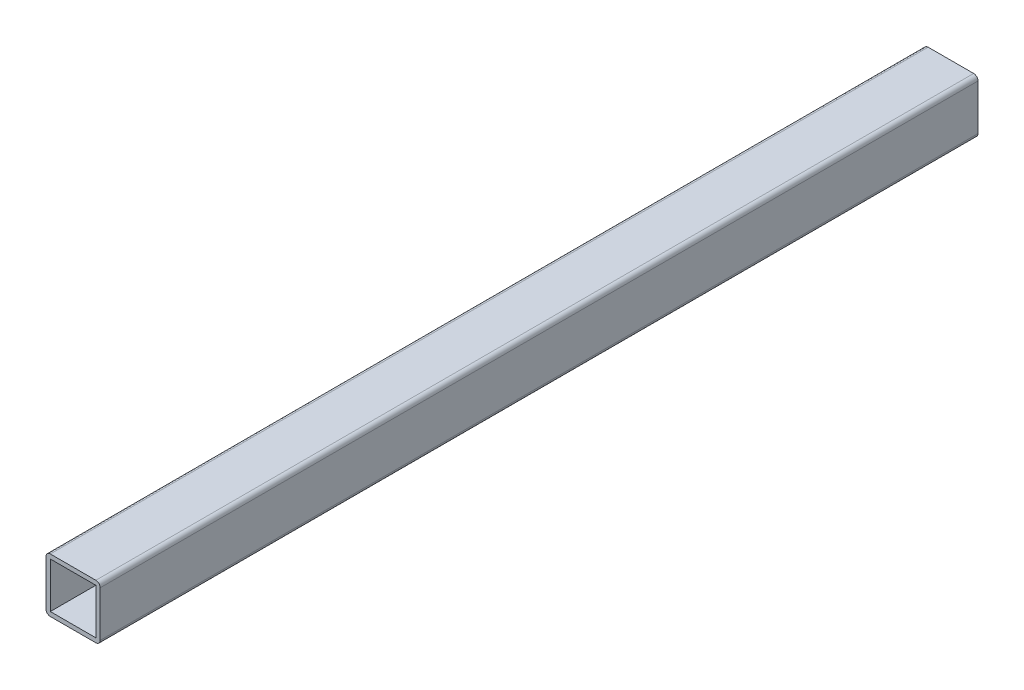
ISO-10303-21;
HEADER;
FILE_DESCRIPTION(('STEP AP214'),'2;1');
FILE_NAME('part.step','',(''),(''),'','','');
FILE_SCHEMA(('AUTOMOTIVE_DESIGN { 1 0 10303 214 1 1 1 1 }'));
ENDSEC;
DATA;
#1=APPLICATION_CONTEXT('core data for automotive mechanical design processes');
#2=APPLICATION_PROTOCOL_DEFINITION('international standard','automotive_design',2000,#1);
#3=PRODUCT_CONTEXT('',#1,'mechanical');
#4=PRODUCT('Part','Part','',(#3));
#5=PRODUCT_RELATED_PRODUCT_CATEGORY('part','',(#4));
#6=PRODUCT_DEFINITION_FORMATION('','',#4);
#7=PRODUCT_DEFINITION_CONTEXT('part definition',#1,'design');
#8=PRODUCT_DEFINITION('design','',#6,#7);
#9=PRODUCT_DEFINITION_SHAPE('','',#8);
#10=(LENGTH_UNIT() NAMED_UNIT(*) SI_UNIT(.MILLI.,.METRE.));
#11=(NAMED_UNIT(*) PLANE_ANGLE_UNIT() SI_UNIT($,.RADIAN.));
#12=(NAMED_UNIT(*) SI_UNIT($,.STERADIAN.) SOLID_ANGLE_UNIT());
#13=UNCERTAINTY_MEASURE_WITH_UNIT(LENGTH_MEASURE(1.E-05),#10,'distance_accuracy_value','');
#14=(GEOMETRIC_REPRESENTATION_CONTEXT(3) GLOBAL_UNCERTAINTY_ASSIGNED_CONTEXT((#13)) GLOBAL_UNIT_ASSIGNED_CONTEXT((#10,
#11,#12)) REPRESENTATION_CONTEXT('',''));
#15=CARTESIAN_POINT('',(0.,0.,0.));
#16=DIRECTION('',(0.,0.,1.));
#17=DIRECTION('',(1.,0.,0.));
#18=AXIS2_PLACEMENT_3D('',#15,#16,#17);
#19=CARTESIAN_POINT('',(4.,46.,810.));
#20=DIRECTION('',(0.,0.,-1.));
#21=DIRECTION('',(-1.,0.,0.));
#22=AXIS2_PLACEMENT_3D('',#19,#20,#21);
#23=PLANE('',#22);
#24=CARTESIAN_POINT('',(4.,46.,810.));
#25=DIRECTION('',(0.,0.,1.));
#26=DIRECTION('',(-1.,0.,0.));
#27=AXIS2_PLACEMENT_3D('',#24,#25,#26);
#28=CIRCLE('',#27,4.);
#29=CARTESIAN_POINT('',(4.,50.,810.));
#30=VERTEX_POINT('',#29);
#31=CARTESIAN_POINT('',(0.,46.,810.));
#32=VERTEX_POINT('',#31);
#33=EDGE_CURVE('E159',#30,#32,#28,.T.);
#34=ORIENTED_EDGE('',*,*,#33,.T.);
#35=DIRECTION('',(0.,-1.,0.));
#36=VECTOR('',#35,1.);
#37=CARTESIAN_POINT('',(0.,4.00000000000003,810.));
#38=LINE('',#37,#36);
#39=CARTESIAN_POINT('',(0.,4.00000000000003,810.));
#40=VERTEX_POINT('',#39);
#41=EDGE_CURVE('E162',#32,#40,#38,.T.);
#42=ORIENTED_EDGE('',*,*,#41,.T.);
#43=CARTESIAN_POINT('',(4.,4.,810.));
#44=DIRECTION('',(0.,0.,1.));
#45=DIRECTION('',(-1.,0.,0.));
#46=AXIS2_PLACEMENT_3D('',#43,#44,#45);
#47=CIRCLE('',#46,4.);
#48=CARTESIAN_POINT('',(4.00000000000003,0.,810.));
#49=VERTEX_POINT('',#48);
#50=EDGE_CURVE('E165',#40,#49,#47,.T.);
#51=ORIENTED_EDGE('',*,*,#50,.T.);
#52=DIRECTION('',(1.,0.,0.));
#53=VECTOR('',#52,1.);
#54=CARTESIAN_POINT('',(4.00000000000003,0.,810.));
#55=LINE('',#54,#53);
#56=CARTESIAN_POINT('',(46.,0.,810.));
#57=VERTEX_POINT('',#56);
#58=EDGE_CURVE('E167',#49,#57,#55,.T.);
#59=ORIENTED_EDGE('',*,*,#58,.T.);
#60=CARTESIAN_POINT('',(46.,4.,810.));
#61=DIRECTION('',(0.,0.,1.));
#62=DIRECTION('',(1.,0.,0.));
#63=AXIS2_PLACEMENT_3D('',#60,#61,#62);
#64=CIRCLE('',#63,4.);
#65=CARTESIAN_POINT('',(50.,4.,810.));
#66=VERTEX_POINT('',#65);
#67=EDGE_CURVE('E169',#57,#66,#64,.T.);
#68=ORIENTED_EDGE('',*,*,#67,.T.);
#69=DIRECTION('',(0.,1.,0.));
#70=VECTOR('',#69,1.);
#71=CARTESIAN_POINT('',(50.,4.,810.));
#72=LINE('',#71,#70);
#73=CARTESIAN_POINT('',(50.,46.,810.));
#74=VERTEX_POINT('',#73);
#75=EDGE_CURVE('E171',#66,#74,#72,.T.);
#76=ORIENTED_EDGE('',*,*,#75,.T.);
#77=CARTESIAN_POINT('',(46.,46.,810.));
#78=DIRECTION('',(0.,0.,1.));
#79=DIRECTION('',(1.,0.,0.));
#80=AXIS2_PLACEMENT_3D('',#77,#78,#79);
#81=CIRCLE('',#80,4.);
#82=CARTESIAN_POINT('',(46.,50.,810.));
#83=VERTEX_POINT('',#82);
#84=EDGE_CURVE('E173',#74,#83,#81,.T.);
#85=ORIENTED_EDGE('',*,*,#84,.T.);
#86=DIRECTION('',(-1.,0.,0.));
#87=VECTOR('',#86,1.);
#88=CARTESIAN_POINT('',(4.,50.,810.));
#89=LINE('',#88,#87);
#90=EDGE_CURVE('E175',#83,#30,#89,.T.);
#91=ORIENTED_EDGE('',*,*,#90,.T.);
#92=EDGE_LOOP('',(#34,#42,#51,#59,#68,#76,#85,#91));
#93=FACE_BOUND('',#92,.T.);
#94=DIRECTION('',(0.,-1.,0.));
#95=VECTOR('',#94,1.);
#96=CARTESIAN_POINT('',(4.,46.,810.));
#97=LINE('',#96,#95);
#98=CARTESIAN_POINT('',(4.,46.,810.));
#99=VERTEX_POINT('',#98);
#100=CARTESIAN_POINT('',(4.00000000000001,4.,810.));
#101=VERTEX_POINT('',#100);
#102=EDGE_CURVE('E123',#99,#101,#97,.T.);
#103=ORIENTED_EDGE('',*,*,#102,.F.);
#104=DIRECTION('',(-1.,0.,0.));
#105=VECTOR('',#104,1.);
#106=CARTESIAN_POINT('',(4.,46.,810.));
#107=LINE('',#106,#105);
#108=CARTESIAN_POINT('',(46.,46.,810.));
#109=VERTEX_POINT('',#108);
#110=EDGE_CURVE('E145',#109,#99,#107,.T.);
#111=ORIENTED_EDGE('',*,*,#110,.F.);
#112=DIRECTION('',(0.,1.,0.));
#113=VECTOR('',#112,1.);
#114=CARTESIAN_POINT('',(46.,46.,810.));
#115=LINE('',#114,#113);
#116=CARTESIAN_POINT('',(46.,4.,810.));
#117=VERTEX_POINT('',#116);
#118=EDGE_CURVE('E143',#117,#109,#115,.T.);
#119=ORIENTED_EDGE('',*,*,#118,.F.);
#120=DIRECTION('',(1.,0.,0.));
#121=VECTOR('',#120,1.);
#122=CARTESIAN_POINT('',(4.00000000000001,4.,810.));
#123=LINE('',#122,#121);
#124=EDGE_CURVE('E131',#101,#117,#123,.T.);
#125=ORIENTED_EDGE('',*,*,#124,.F.);
#126=EDGE_LOOP('',(#103,#111,#119,#125));
#127=FACE_BOUND('',#126,.T.);
#128=ADVANCED_FACE('F34',(#93,#127),#23,.F.);
#129=CARTESIAN_POINT('',(4.,46.,0.));
#130=DIRECTION('',(0.,0.,-1.));
#131=DIRECTION('',(-1.,0.,0.));
#132=AXIS2_PLACEMENT_3D('',#129,#130,#131);
#133=PLANE('',#132);
#134=CARTESIAN_POINT('',(4.,46.,0.));
#135=DIRECTION('',(0.,0.,1.));
#136=DIRECTION('',(-1.,0.,0.));
#137=AXIS2_PLACEMENT_3D('',#134,#135,#136);
#138=CIRCLE('',#137,4.);
#139=CARTESIAN_POINT('',(4.,50.,0.));
#140=VERTEX_POINT('',#139);
#141=CARTESIAN_POINT('',(0.,46.,0.));
#142=VERTEX_POINT('',#141);
#143=EDGE_CURVE('E139',#140,#142,#138,.T.);
#144=ORIENTED_EDGE('',*,*,#143,.F.);
#145=DIRECTION('',(-1.,0.,0.));
#146=VECTOR('',#145,1.);
#147=CARTESIAN_POINT('',(4.,50.,0.));
#148=LINE('',#147,#146);
#149=CARTESIAN_POINT('',(46.,50.,0.));
#150=VERTEX_POINT('',#149);
#151=EDGE_CURVE('E163',#150,#140,#148,.T.);
#152=ORIENTED_EDGE('',*,*,#151,.F.);
#153=CARTESIAN_POINT('',(46.,46.,0.));
#154=DIRECTION('',(0.,0.,1.));
#155=DIRECTION('',(1.,0.,0.));
#156=AXIS2_PLACEMENT_3D('',#153,#154,#155);
#157=CIRCLE('',#156,4.);
#158=CARTESIAN_POINT('',(50.,46.,0.));
#159=VERTEX_POINT('',#158);
#160=EDGE_CURVE('E190',#159,#150,#157,.T.);
#161=ORIENTED_EDGE('',*,*,#160,.F.);
#162=DIRECTION('',(0.,1.,0.));
#163=VECTOR('',#162,1.);
#164=CARTESIAN_POINT('',(50.,4.,0.));
#165=LINE('',#164,#163);
#166=CARTESIAN_POINT('',(50.,4.,0.));
#167=VERTEX_POINT('',#166);
#168=EDGE_CURVE('E188',#167,#159,#165,.T.);
#169=ORIENTED_EDGE('',*,*,#168,.F.);
#170=CARTESIAN_POINT('',(46.,4.,0.));
#171=DIRECTION('',(0.,0.,1.));
#172=DIRECTION('',(1.,0.,0.));
#173=AXIS2_PLACEMENT_3D('',#170,#171,#172);
#174=CIRCLE('',#173,4.);
#175=CARTESIAN_POINT('',(46.,0.,0.));
#176=VERTEX_POINT('',#175);
#177=EDGE_CURVE('E186',#176,#167,#174,.T.);
#178=ORIENTED_EDGE('',*,*,#177,.F.);
#179=DIRECTION('',(1.,0.,0.));
#180=VECTOR('',#179,1.);
#181=CARTESIAN_POINT('',(4.00000000000003,0.,0.));
#182=LINE('',#181,#180);
#183=CARTESIAN_POINT('',(4.00000000000003,0.,0.));
#184=VERTEX_POINT('',#183);
#185=EDGE_CURVE('E184',#184,#176,#182,.T.);
#186=ORIENTED_EDGE('',*,*,#185,.F.);
#187=CARTESIAN_POINT('',(4.,4.,0.));
#188=DIRECTION('',(0.,0.,1.));
#189=DIRECTION('',(-1.,0.,0.));
#190=AXIS2_PLACEMENT_3D('',#187,#188,#189);
#191=CIRCLE('',#190,4.);
#192=CARTESIAN_POINT('',(0.,4.00000000000003,0.));
#193=VERTEX_POINT('',#192);
#194=EDGE_CURVE('E182',#193,#184,#191,.T.);
#195=ORIENTED_EDGE('',*,*,#194,.F.);
#196=DIRECTION('',(0.,-1.,0.));
#197=VECTOR('',#196,1.);
#198=CARTESIAN_POINT('',(0.,4.00000000000003,0.));
#199=LINE('',#198,#197);
#200=EDGE_CURVE('E180',#142,#193,#199,.T.);
#201=ORIENTED_EDGE('',*,*,#200,.F.);
#202=EDGE_LOOP('',(#144,#152,#161,#169,#178,#186,#195,#201));
#203=FACE_BOUND('',#202,.T.);
#204=DIRECTION('',(-1.,0.,0.));
#205=VECTOR('',#204,1.);
#206=CARTESIAN_POINT('',(4.,46.,0.));
#207=LINE('',#206,#205);
#208=CARTESIAN_POINT('',(46.,46.,0.));
#209=VERTEX_POINT('',#208);
#210=CARTESIAN_POINT('',(4.,46.,0.));
#211=VERTEX_POINT('',#210);
#212=EDGE_CURVE('E132',#209,#211,#207,.T.);
#213=ORIENTED_EDGE('',*,*,#212,.T.);
#214=DIRECTION('',(0.,-1.,0.));
#215=VECTOR('',#214,1.);
#216=CARTESIAN_POINT('',(4.,46.,0.));
#217=LINE('',#216,#215);
#218=CARTESIAN_POINT('',(4.00000000000001,4.,0.));
#219=VERTEX_POINT('',#218);
#220=EDGE_CURVE('E57',#211,#219,#217,.T.);
#221=ORIENTED_EDGE('',*,*,#220,.T.);
#222=DIRECTION('',(1.,0.,0.));
#223=VECTOR('',#222,1.);
#224=CARTESIAN_POINT('',(4.00000000000001,4.,0.));
#225=LINE('',#224,#223);
#226=CARTESIAN_POINT('',(46.,4.,0.));
#227=VERTEX_POINT('',#226);
#228=EDGE_CURVE('E138',#219,#227,#225,.T.);
#229=ORIENTED_EDGE('',*,*,#228,.T.);
#230=DIRECTION('',(0.,1.,0.));
#231=VECTOR('',#230,1.);
#232=CARTESIAN_POINT('',(46.,46.,0.));
#233=LINE('',#232,#231);
#234=EDGE_CURVE('E151',#227,#209,#233,.T.);
#235=ORIENTED_EDGE('',*,*,#234,.T.);
#236=EDGE_LOOP('',(#213,#221,#229,#235));
#237=FACE_BOUND('',#236,.T.);
#238=ADVANCED_FACE('F220',(#203,#237),#133,.T.);
#239=CARTESIAN_POINT('',(4.,46.,810.));
#240=DIRECTION('',(0.,0.,-1.));
#241=DIRECTION('',(-1.,0.,0.));
#242=AXIS2_PLACEMENT_3D('',#239,#240,#241);
#243=CYLINDRICAL_SURFACE('',#242,4.);
#244=ORIENTED_EDGE('',*,*,#143,.T.);
#245=DIRECTION('',(0.,0.,-1.));
#246=VECTOR('',#245,1.);
#247=CARTESIAN_POINT('',(0.,46.,810.));
#248=LINE('',#247,#246);
#249=EDGE_CURVE('E11',#32,#142,#248,.T.);
#250=ORIENTED_EDGE('',*,*,#249,.F.);
#251=ORIENTED_EDGE('',*,*,#33,.F.);
#252=DIRECTION('',(0.,0.,-1.));
#253=VECTOR('',#252,1.);
#254=CARTESIAN_POINT('',(4.,50.,810.));
#255=LINE('',#254,#253);
#256=EDGE_CURVE('E177',#30,#140,#255,.T.);
#257=ORIENTED_EDGE('',*,*,#256,.T.);
#258=EDGE_LOOP('',(#244,#250,#251,#257));
#259=FACE_BOUND('',#258,.T.);
#260=ADVANCED_FACE('F36',(#259),#243,.T.);
#261=CARTESIAN_POINT('',(0.,4.00000000000003,810.));
#262=DIRECTION('',(1.,0.,0.));
#263=DIRECTION('',(0.,0.,-1.));
#264=AXIS2_PLACEMENT_3D('',#261,#262,#263);
#265=PLANE('',#264);
#266=ORIENTED_EDGE('',*,*,#200,.T.);
#267=DIRECTION('',(0.,0.,-1.));
#268=VECTOR('',#267,1.);
#269=CARTESIAN_POINT('',(0.,4.00000000000003,810.));
#270=LINE('',#269,#268);
#271=EDGE_CURVE('E42',#40,#193,#270,.T.);
#272=ORIENTED_EDGE('',*,*,#271,.F.);
#273=ORIENTED_EDGE('',*,*,#41,.F.);
#274=ORIENTED_EDGE('',*,*,#249,.T.);
#275=EDGE_LOOP('',(#266,#272,#273,#274));
#276=FACE_BOUND('',#275,.T.);
#277=ADVANCED_FACE('F237',(#276),#265,.F.);
#278=CARTESIAN_POINT('',(4.,4.,810.));
#279=DIRECTION('',(0.,0.,-1.));
#280=DIRECTION('',(-1.,0.,0.));
#281=AXIS2_PLACEMENT_3D('',#278,#279,#280);
#282=CYLINDRICAL_SURFACE('',#281,4.);
#283=ORIENTED_EDGE('',*,*,#194,.T.);
#284=DIRECTION('',(0.,0.,-1.));
#285=VECTOR('',#284,1.);
#286=CARTESIAN_POINT('',(4.00000000000003,0.,810.));
#287=LINE('',#286,#285);
#288=EDGE_CURVE('E207',#49,#184,#287,.T.);
#289=ORIENTED_EDGE('',*,*,#288,.F.);
#290=ORIENTED_EDGE('',*,*,#50,.F.);
#291=ORIENTED_EDGE('',*,*,#271,.T.);
#292=EDGE_LOOP('',(#283,#289,#290,#291));
#293=FACE_BOUND('',#292,.T.);
#294=ADVANCED_FACE('F214',(#293),#282,.T.);
#295=CARTESIAN_POINT('',(4.00000000000003,0.,810.));
#296=DIRECTION('',(0.,1.,0.));
#297=DIRECTION('',(0.,0.,1.));
#298=AXIS2_PLACEMENT_3D('',#295,#296,#297);
#299=PLANE('',#298);
#300=ORIENTED_EDGE('',*,*,#185,.T.);
#301=DIRECTION('',(0.,0.,-1.));
#302=VECTOR('',#301,1.);
#303=CARTESIAN_POINT('',(46.,0.,810.));
#304=LINE('',#303,#302);
#305=EDGE_CURVE('E204',#57,#176,#304,.T.);
#306=ORIENTED_EDGE('',*,*,#305,.F.);
#307=ORIENTED_EDGE('',*,*,#58,.F.);
#308=ORIENTED_EDGE('',*,*,#288,.T.);
#309=EDGE_LOOP('',(#300,#306,#307,#308));
#310=FACE_BOUND('',#309,.T.);
#311=ADVANCED_FACE('F226',(#310),#299,.F.);
#312=CARTESIAN_POINT('',(46.,4.,810.));
#313=DIRECTION('',(0.,0.,-1.));
#314=DIRECTION('',(-1.,0.,0.));
#315=AXIS2_PLACEMENT_3D('',#312,#313,#314);
#316=CYLINDRICAL_SURFACE('',#315,4.);
#317=ORIENTED_EDGE('',*,*,#177,.T.);
#318=DIRECTION('',(0.,0.,-1.));
#319=VECTOR('',#318,1.);
#320=CARTESIAN_POINT('',(50.,4.,810.));
#321=LINE('',#320,#319);
#322=EDGE_CURVE('E201',#66,#167,#321,.T.);
#323=ORIENTED_EDGE('',*,*,#322,.F.);
#324=ORIENTED_EDGE('',*,*,#67,.F.);
#325=ORIENTED_EDGE('',*,*,#305,.T.);
#326=EDGE_LOOP('',(#317,#323,#324,#325));
#327=FACE_BOUND('',#326,.T.);
#328=ADVANCED_FACE('F230',(#327),#316,.T.);
#329=CARTESIAN_POINT('',(50.,4.,810.));
#330=DIRECTION('',(-1.,0.,0.));
#331=DIRECTION('',(0.,0.,1.));
#332=AXIS2_PLACEMENT_3D('',#329,#330,#331);
#333=PLANE('',#332);
#334=ORIENTED_EDGE('',*,*,#168,.T.);
#335=DIRECTION('',(0.,0.,-1.));
#336=VECTOR('',#335,1.);
#337=CARTESIAN_POINT('',(50.,46.,810.));
#338=LINE('',#337,#336);
#339=EDGE_CURVE('E198',#74,#159,#338,.T.);
#340=ORIENTED_EDGE('',*,*,#339,.F.);
#341=ORIENTED_EDGE('',*,*,#75,.F.);
#342=ORIENTED_EDGE('',*,*,#322,.T.);
#343=EDGE_LOOP('',(#334,#340,#341,#342));
#344=FACE_BOUND('',#343,.T.);
#345=ADVANCED_FACE('F250',(#344),#333,.F.);
#346=CARTESIAN_POINT('',(46.,46.,810.));
#347=DIRECTION('',(0.,0.,-1.));
#348=DIRECTION('',(-1.,0.,0.));
#349=AXIS2_PLACEMENT_3D('',#346,#347,#348);
#350=CYLINDRICAL_SURFACE('',#349,4.);
#351=ORIENTED_EDGE('',*,*,#160,.T.);
#352=DIRECTION('',(0.,0.,-1.));
#353=VECTOR('',#352,1.);
#354=CARTESIAN_POINT('',(46.,50.,810.));
#355=LINE('',#354,#353);
#356=EDGE_CURVE('E195',#83,#150,#355,.T.);
#357=ORIENTED_EDGE('',*,*,#356,.F.);
#358=ORIENTED_EDGE('',*,*,#84,.F.);
#359=ORIENTED_EDGE('',*,*,#339,.T.);
#360=EDGE_LOOP('',(#351,#357,#358,#359));
#361=FACE_BOUND('',#360,.T.);
#362=ADVANCED_FACE('F248',(#361),#350,.T.);
#363=CARTESIAN_POINT('',(4.,50.,810.));
#364=DIRECTION('',(0.,-1.,0.));
#365=DIRECTION('',(0.,0.,-1.));
#366=AXIS2_PLACEMENT_3D('',#363,#364,#365);
#367=PLANE('',#366);
#368=ORIENTED_EDGE('',*,*,#151,.T.);
#369=ORIENTED_EDGE('',*,*,#256,.F.);
#370=ORIENTED_EDGE('',*,*,#90,.F.);
#371=ORIENTED_EDGE('',*,*,#356,.T.);
#372=EDGE_LOOP('',(#368,#369,#370,#371));
#373=FACE_BOUND('',#372,.T.);
#374=ADVANCED_FACE('F243',(#373),#367,.F.);
#375=CARTESIAN_POINT('',(4.,46.,810.));
#376=DIRECTION('',(1.,0.,0.));
#377=DIRECTION('',(0.,1.,0.));
#378=AXIS2_PLACEMENT_3D('',#375,#376,#377);
#379=PLANE('',#378);
#380=ORIENTED_EDGE('',*,*,#220,.F.);
#381=DIRECTION('',(0.,0.,-1.));
#382=VECTOR('',#381,1.);
#383=CARTESIAN_POINT('',(4.,46.,810.));
#384=LINE('',#383,#382);
#385=EDGE_CURVE('E127',#99,#211,#384,.T.);
#386=ORIENTED_EDGE('',*,*,#385,.F.);
#387=ORIENTED_EDGE('',*,*,#102,.T.);
#388=DIRECTION('',(0.,0.,-1.));
#389=VECTOR('',#388,1.);
#390=CARTESIAN_POINT('',(4.00000000000001,4.,810.));
#391=LINE('',#390,#389);
#392=EDGE_CURVE('E126',#101,#219,#391,.T.);
#393=ORIENTED_EDGE('',*,*,#392,.T.);
#394=EDGE_LOOP('',(#380,#386,#387,#393));
#395=FACE_BOUND('',#394,.T.);
#396=ADVANCED_FACE('F125',(#395),#379,.T.);
#397=CARTESIAN_POINT('',(4.00000000000001,4.,810.));
#398=DIRECTION('',(0.,1.,0.));
#399=DIRECTION('',(0.,0.,1.));
#400=AXIS2_PLACEMENT_3D('',#397,#398,#399);
#401=PLANE('',#400);
#402=ORIENTED_EDGE('',*,*,#228,.F.);
#403=ORIENTED_EDGE('',*,*,#392,.F.);
#404=ORIENTED_EDGE('',*,*,#124,.T.);
#405=DIRECTION('',(0.,0.,-1.));
#406=VECTOR('',#405,1.);
#407=CARTESIAN_POINT('',(46.,4.,810.));
#408=LINE('',#407,#406);
#409=EDGE_CURVE('E140',#117,#227,#408,.T.);
#410=ORIENTED_EDGE('',*,*,#409,.T.);
#411=EDGE_LOOP('',(#402,#403,#404,#410));
#412=FACE_BOUND('',#411,.T.);
#413=ADVANCED_FACE('F135',(#412),#401,.T.);
#414=CARTESIAN_POINT('',(46.,46.,810.));
#415=DIRECTION('',(-1.,0.,0.));
#416=DIRECTION('',(0.,-1.,0.));
#417=AXIS2_PLACEMENT_3D('',#414,#415,#416);
#418=PLANE('',#417);
#419=ORIENTED_EDGE('',*,*,#234,.F.);
#420=ORIENTED_EDGE('',*,*,#409,.F.);
#421=ORIENTED_EDGE('',*,*,#118,.T.);
#422=DIRECTION('',(0.,0.,-1.));
#423=VECTOR('',#422,1.);
#424=CARTESIAN_POINT('',(46.,46.,810.));
#425=LINE('',#424,#423);
#426=EDGE_CURVE('E49',#109,#209,#425,.T.);
#427=ORIENTED_EDGE('',*,*,#426,.T.);
#428=EDGE_LOOP('',(#419,#420,#421,#427));
#429=FACE_BOUND('',#428,.T.);
#430=ADVANCED_FACE('F275',(#429),#418,.T.);
#431=CARTESIAN_POINT('',(4.,46.,810.));
#432=DIRECTION('',(0.,-1.,0.));
#433=DIRECTION('',(0.,0.,-1.));
#434=AXIS2_PLACEMENT_3D('',#431,#432,#433);
#435=PLANE('',#434);
#436=ORIENTED_EDGE('',*,*,#212,.F.);
#437=ORIENTED_EDGE('',*,*,#426,.F.);
#438=ORIENTED_EDGE('',*,*,#110,.T.);
#439=ORIENTED_EDGE('',*,*,#385,.T.);
#440=EDGE_LOOP('',(#436,#437,#438,#439));
#441=FACE_BOUND('',#440,.T.);
#442=ADVANCED_FACE('F279',(#441),#435,.T.);
#443=CLOSED_SHELL('',(#128,#238,#260,#277,#294,#311,#328,#345,#362,#374,#396,#413,#430,#442));
#444=MANIFOLD_SOLID_BREP('B2',#443);
#445=ADVANCED_BREP_SHAPE_REPRESENTATION('',(#18,#444),#14);
#446=SHAPE_DEFINITION_REPRESENTATION(#9,#445);
ENDSEC;
END-ISO-10303-21;
